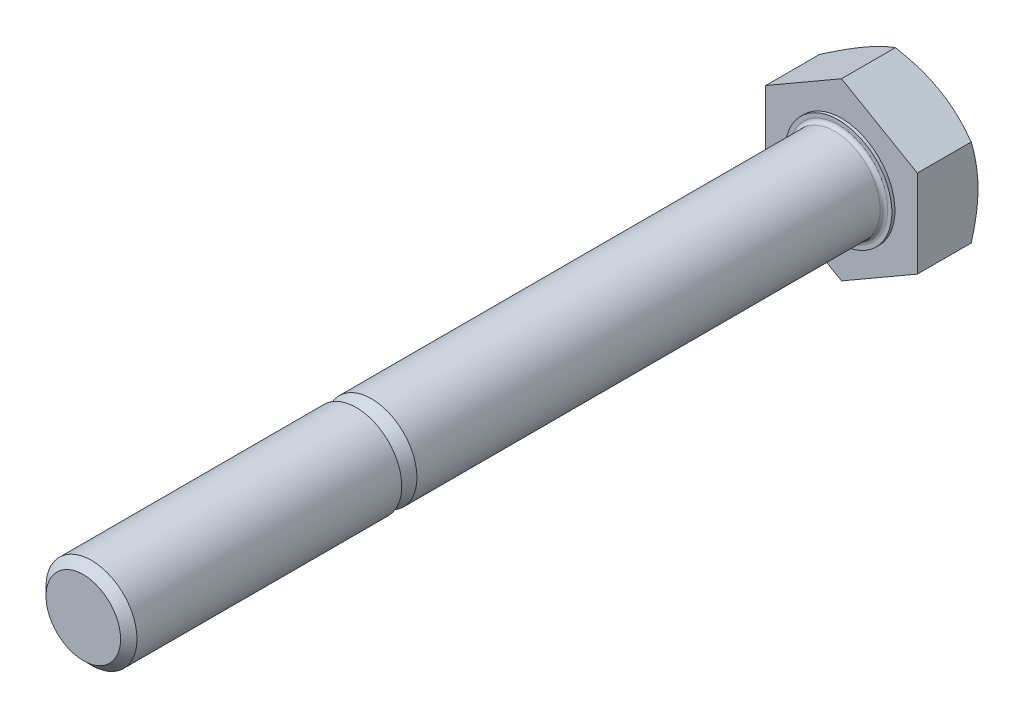
ISO-10303-21;
HEADER;
FILE_DESCRIPTION(('STEP AP214'),'2;1');
FILE_NAME('part.step','',(''),(''),'','','');
FILE_SCHEMA(('AUTOMOTIVE_DESIGN { 1 0 10303 214 1 1 1 1 }'));
ENDSEC;
DATA;
#1=APPLICATION_CONTEXT('core data for automotive mechanical design processes');
#2=APPLICATION_PROTOCOL_DEFINITION('international standard','automotive_design',2000,#1);
#3=PRODUCT_CONTEXT('',#1,'mechanical');
#4=PRODUCT('Part','Part','',(#3));
#5=PRODUCT_RELATED_PRODUCT_CATEGORY('part','',(#4));
#6=PRODUCT_DEFINITION_FORMATION('','',#4);
#7=PRODUCT_DEFINITION_CONTEXT('part definition',#1,'design');
#8=PRODUCT_DEFINITION('design','',#6,#7);
#9=PRODUCT_DEFINITION_SHAPE('','',#8);
#10=(LENGTH_UNIT() NAMED_UNIT(*) SI_UNIT(.MILLI.,.METRE.));
#11=(NAMED_UNIT(*) PLANE_ANGLE_UNIT() SI_UNIT($,.RADIAN.));
#12=(NAMED_UNIT(*) SI_UNIT($,.STERADIAN.) SOLID_ANGLE_UNIT());
#13=UNCERTAINTY_MEASURE_WITH_UNIT(LENGTH_MEASURE(1.E-05),#10,'distance_accuracy_value','');
#14=(GEOMETRIC_REPRESENTATION_CONTEXT(3) GLOBAL_UNCERTAINTY_ASSIGNED_CONTEXT((#13)) GLOBAL_UNIT_ASSIGNED_CONTEXT((#10,
#11,#12)) REPRESENTATION_CONTEXT('',''));
#15=CARTESIAN_POINT('',(0.,0.,0.));
#16=DIRECTION('',(0.,0.,1.));
#17=DIRECTION('',(1.,0.,0.));
#18=AXIS2_PLACEMENT_3D('',#15,#16,#17);
#19=CARTESIAN_POINT('',(5.,-2.88675134594812,-5.));
#20=DIRECTION('',(-0.5,0.866025403784439,0.));
#21=DIRECTION('',(0.866025403784439,0.5,0.));
#22=AXIS2_PLACEMENT_3D('',#19,#20,#21);
#23=PLANE('',#22);
#24=CARTESIAN_POINT('',(5.000002,-2.88675019124759,-3.55341734594793));
#25=CARTESIAN_POINT('',(4.78027074694607,-3.01361208934764,-3.62667401283849));
#26=CARTESIAN_POINT('',(4.5586601198803,-3.14155904453935,-3.69330350087609));
#27=CARTESIAN_POINT('',(4.11160176522467,-3.39966830594325,-3.80960388176341));
#28=CARTESIAN_POINT('',(3.88614609670003,-3.52983519685628,-3.859233638035));
#29=CARTESIAN_POINT('',(3.43799439633442,-3.78857570170015,-3.93647343389728));
#30=CARTESIAN_POINT('',(3.21536814331772,-3.91710902880802,-3.96459799992946));
#31=CARTESIAN_POINT('',(2.8806459561398,-4.11036097367893,-3.98981464288414));
#32=CARTESIAN_POINT('',(2.76899557601673,-4.17482235069811,-3.99539321968897));
#33=CARTESIAN_POINT('',(2.54559174139457,-4.30380461475521,-4.00079886451652));
#34=CARTESIAN_POINT('',(2.43383829018766,-4.36832549989239,-4.00062611028573));
#35=CARTESIAN_POINT('',(2.12769088590962,-4.54507978616402,-3.99223835401767));
#36=CARTESIAN_POINT('',(1.93339845483021,-4.65725457354923,-3.97816111429647));
#37=CARTESIAN_POINT('',(1.54610304420474,-4.88085968312974,-3.93352860367383));
#38=CARTESIAN_POINT('',(1.35310142524446,-4.9922892197905,-3.90295808665975));
#39=CARTESIAN_POINT('',(0.965026180739004,-5.21634456667155,-3.826542206783));
#40=CARTESIAN_POINT('',(0.770001514907567,-5.32894210998795,-3.78037315312653));
#41=CARTESIAN_POINT('',(0.382860131316657,-5.55245829201861,-3.67558875648398));
#42=CARTESIAN_POINT('',(0.190738457644298,-5.66337979203051,-3.61699801824105));
#43=CARTESIAN_POINT('',(-1.9999999993508E-06,-5.7735038465968,-3.55341734594793));
#44=B_SPLINE_CURVE_WITH_KNOTS('',3,(#24,#25,#26,#27,#28,#29,#30,#31,#32,#33,#34,#35,#36,#37,#38,
#39,#40,#41,#42,#43),.UNSPECIFIED.,.F.,.F.,(4,2,2,2,2,2,2,2,2,4),(0.,0.792540187012439,
1.58698486313849,2.36176947896395,2.74878786986339,3.13579429986343,3.80946255620209,
4.48375460996337,5.17299926182492,5.86089121185928),.UNSPECIFIED.);
#45=CARTESIAN_POINT('',(5.,-2.88675134594812,-3.5534180126148));
#46=VERTEX_POINT('',#45);
#47=CARTESIAN_POINT('',(2.5,-4.33012701892219,-4.));
#48=VERTEX_POINT('',#47);
#49=EDGE_CURVE('E136',#46,#48,#44,.T.);
#50=ORIENTED_EDGE('',*,*,#49,.F.);
#51=DIRECTION('',(0.,0.,-1.));
#52=VECTOR('',#51,1.);
#53=CARTESIAN_POINT('',(5.,-2.88675134594812,-2.61479466551195E-09));
#54=LINE('',#53,#52);
#55=CARTESIAN_POINT('',(5.,-2.88675134594812,-2.61479466551195E-09));
#56=VERTEX_POINT('',#55);
#57=EDGE_CURVE('E121',#56,#46,#54,.T.);
#58=ORIENTED_EDGE('',*,*,#57,.F.);
#59=DIRECTION('',(0.866025403784438,0.500000000000001,0.));
#60=VECTOR('',#59,1.);
#61=CARTESIAN_POINT('',(5.,-2.88675134594812,-2.61479466551195E-09));
#62=LINE('',#61,#60);
#63=CARTESIAN_POINT('',(0.,-5.77350269189626,-2.61479466551195E-09));
#64=VERTEX_POINT('',#63);
#65=EDGE_CURVE('E127',#64,#56,#62,.T.);
#66=ORIENTED_EDGE('',*,*,#65,.F.);
#67=DIRECTION('',(0.,0.,-1.));
#68=VECTOR('',#67,1.);
#69=CARTESIAN_POINT('',(0.,-5.77350269189626,-2.61479466551195E-09));
#70=LINE('',#69,#68);
#71=CARTESIAN_POINT('',(0.,-5.77350269189626,-3.55341801261479));
#72=VERTEX_POINT('',#71);
#73=EDGE_CURVE('E244',#64,#72,#70,.T.);
#74=ORIENTED_EDGE('',*,*,#73,.T.);
#75=EDGE_CURVE('E59',#48,#72,#44,.T.);
#76=ORIENTED_EDGE('',*,*,#75,.F.);
#77=EDGE_LOOP('',(#50,#58,#66,#74,#76));
#78=FACE_BOUND('',#77,.T.);
#79=ADVANCED_FACE('F44',(#78),#23,.F.);
#80=CARTESIAN_POINT('',(0.,-5.77350269189626,-5.));
#81=DIRECTION('',(0.5,0.866025403784439,0.));
#82=DIRECTION('',(0.866025403784439,-0.5,0.));
#83=AXIS2_PLACEMENT_3D('',#80,#81,#82);
#84=PLANE('',#83);
#85=CARTESIAN_POINT('',(2.00000000064743E-06,-5.7735038465968,-3.55341734594793));
#86=CARTESIAN_POINT('',(-0.219729253053924,-5.64664194849674,-3.62667401283849));
#87=CARTESIAN_POINT('',(-0.441339880119702,-5.51869499330503,-3.69330350087609));
#88=CARTESIAN_POINT('',(-0.888398234775334,-5.26058573190113,-3.80960388176341));
#89=CARTESIAN_POINT('',(-1.11385390329997,-5.13041884098811,-3.85923363803499));
#90=CARTESIAN_POINT('',(-1.56200560366558,-4.87167833614423,-3.93647343389728));
#91=CARTESIAN_POINT('',(-1.78463185668228,-4.74314500903636,-3.96459799992946));
#92=CARTESIAN_POINT('',(-2.1193540438602,-4.54989306416545,-3.98981464288413));
#93=CARTESIAN_POINT('',(-2.23100442398327,-4.48543168714627,-3.99539321968897));
#94=CARTESIAN_POINT('',(-2.45440825860543,-4.35644942308917,-4.00079886451652));
#95=CARTESIAN_POINT('',(-2.56616170981234,-4.291928537952,-4.00062611028572));
#96=CARTESIAN_POINT('',(-2.87230911409038,-4.11517425168036,-3.99223835401768));
#97=CARTESIAN_POINT('',(-3.06660154516979,-4.00299946429516,-3.97816111429647));
#98=CARTESIAN_POINT('',(-3.45389695579525,-3.77939435471464,-3.93352860367382));
#99=CARTESIAN_POINT('',(-3.64689857475554,-3.66796481805389,-3.90295808665975));
#100=CARTESIAN_POINT('',(-4.03497381926099,-3.44390947117283,-3.826542206783));
#101=CARTESIAN_POINT('',(-4.22999848509243,-3.33131192785644,-3.78037315312652));
#102=CARTESIAN_POINT('',(-4.61713986868334,-3.10779574582578,-3.67558875648398));
#103=CARTESIAN_POINT('',(-4.8092615423557,-2.99687424581388,-3.61699801824105));
#104=CARTESIAN_POINT('',(-5.000002,-2.88675019124759,-3.55341734594793));
#105=B_SPLINE_CURVE_WITH_KNOTS('',3,(#85,#86,#87,#88,#89,#90,#91,#92,#93,#94,#95,#96,#97,#98,
#99,#100,#101,#102,#103,#104),.UNSPECIFIED.,.F.,.F.,(4,2,2,2,2,2,2,2,2,4),(0.,0.792540187012439,
1.58698486313849,2.36176947896395,2.74878786986339,3.13579429986343,3.80946255620209,
4.48375460996337,5.17299926182492,5.86089121185927),.UNSPECIFIED.);
#106=CARTESIAN_POINT('',(-2.5,-4.3301270189222,-4.));
#107=VERTEX_POINT('',#106);
#108=EDGE_CURVE('E186',#72,#107,#105,.T.);
#109=ORIENTED_EDGE('',*,*,#108,.F.);
#110=ORIENTED_EDGE('',*,*,#73,.F.);
#111=DIRECTION('',(0.866025403784439,-0.5,0.));
#112=VECTOR('',#111,1.);
#113=CARTESIAN_POINT('',(0.,-5.77350269189626,-2.61479466551195E-09));
#114=LINE('',#113,#112);
#115=CARTESIAN_POINT('',(-5.,-2.88675134594813,-2.61479466551195E-09));
#116=VERTEX_POINT('',#115);
#117=EDGE_CURVE('E132',#116,#64,#114,.T.);
#118=ORIENTED_EDGE('',*,*,#117,.F.);
#119=DIRECTION('',(0.,0.,-1.));
#120=VECTOR('',#119,1.);
#121=CARTESIAN_POINT('',(-5.,-2.88675134594813,-2.61479466551195E-09));
#122=LINE('',#121,#120);
#123=CARTESIAN_POINT('',(-5.,-2.88675134594813,-3.55341801261479));
#124=VERTEX_POINT('',#123);
#125=EDGE_CURVE('E249',#116,#124,#122,.T.);
#126=ORIENTED_EDGE('',*,*,#125,.T.);
#127=EDGE_CURVE('E67',#107,#124,#105,.T.);
#128=ORIENTED_EDGE('',*,*,#127,.F.);
#129=EDGE_LOOP('',(#109,#110,#118,#126,#128));
#130=FACE_BOUND('',#129,.T.);
#131=ADVANCED_FACE('F236',(#130),#84,.F.);
#132=CARTESIAN_POINT('',(-5.,-2.88675134594813,-5.));
#133=DIRECTION('',(1.,0.,0.));
#134=DIRECTION('',(0.,-1.,0.));
#135=AXIS2_PLACEMENT_3D('',#132,#133,#134);
#136=PLANE('',#135);
#137=CARTESIAN_POINT('',(-5.,7.65620989160719,-1.60730851220314));
#138=CARTESIAN_POINT('',(-5.,7.43668068445187,-1.71339764971142));
#139=CARTESIAN_POINT('',(-5.00000000000001,7.2166324498112,-1.81843220971194));
#140=CARTESIAN_POINT('',(-5.00000000000001,6.775217292149,-2.02578955660455));
#141=CARTESIAN_POINT('',(-5.,6.55385014884432,-2.12811187401153));
#142=CARTESIAN_POINT('',(-5.,6.10832079221154,-2.32998113103873));
#143=CARTESIAN_POINT('',(-5.,5.88414983325619,-2.42950883856025));
#144=CARTESIAN_POINT('',(-5.,5.43396545890422,-2.62428946678928));
#145=CARTESIAN_POINT('',(-5.,5.20795214026934,-2.71954261031161));
#146=CARTESIAN_POINT('',(-5.,4.75091730358843,-2.90576853562678));
#147=CARTESIAN_POINT('',(-5.,4.51986836696229,-2.99667439468201));
#148=CARTESIAN_POINT('',(-5.,4.05504511794165,-3.17136663535019));
#149=CARTESIAN_POINT('',(-5.,3.82127050561654,-3.25515222488515));
#150=CARTESIAN_POINT('',(-5.,3.3511049214154,-3.41335295122633));
#151=CARTESIAN_POINT('',(-5.,3.1147207202618,-3.48778800852407));
#152=CARTESIAN_POINT('',(-5.,2.63858935414024,-3.62486947210752));
#153=CARTESIAN_POINT('',(-5.,2.39884327849118,-3.6875196062624));
#154=CARTESIAN_POINT('',(-5.,1.91583600979795,-3.79799301517174));
#155=CARTESIAN_POINT('',(-5.,1.67257390027251,-3.845812348464));
#156=CARTESIAN_POINT('',(-5.,1.18308256945893,-3.92339260894802));
#157=CARTESIAN_POINT('',(-5.,0.936853345569401,-3.95315352030607));
#158=CARTESIAN_POINT('',(-5.,0.567117593289451,-3.98234325133118));
#159=CARTESIAN_POINT('',(-5.,0.444189898759255,-3.98949936634909));
#160=CARTESIAN_POINT('',(-5.,0.198136128994921,-3.99860265589306));
#161=CARTESIAN_POINT('',(-5.,0.0750100563582885,-4.00054989807679));
#162=CARTESIAN_POINT('',(-5.,-0.171177216207566,-3.99918313774808));
#163=CARTESIAN_POINT('',(-5.,-0.29423842464402,-3.99587061329656));
#164=CARTESIAN_POINT('',(-5.,-0.540114422491311,-3.98406827403109));
#165=CARTESIAN_POINT('',(-5.,-0.662929199152969,-3.97557819794883));
#166=CARTESIAN_POINT('',(-5.,-0.960602635172517,-3.94890221291608));
#167=CARTESIAN_POINT('',(-5.,-1.13523252606317,-3.92812146624754));
#168=CARTESIAN_POINT('',(-5.,-1.48312982453558,-3.87724859224778));
#169=CARTESIAN_POINT('',(-5.,-1.65639704728773,-3.84715522336811));
#170=CARTESIAN_POINT('',(-5.,-2.0014599099285,-3.77872143768563));
#171=CARTESIAN_POINT('',(-5.,-2.17325390132186,-3.74037278751756));
#172=CARTESIAN_POINT('',(-5.,-2.51508012917844,-3.65659803659306));
#173=CARTESIAN_POINT('',(-5.,-2.68511247222647,-3.61117236671524));
#174=CARTESIAN_POINT('',(-5.,-3.02759472997325,-3.51314465542335));
#175=CARTESIAN_POINT('',(-5.,-3.20000183568428,-3.46039407843568));
#176=CARTESIAN_POINT('',(-5.,-3.54299370259063,-3.34968060702553));
#177=CARTESIAN_POINT('',(-5.,-3.71357963115188,-3.29172130765132));
#178=CARTESIAN_POINT('',(-5.,-4.0522446464634,-3.17178761900049));
#179=CARTESIAN_POINT('',(-5.,-4.22033243885282,-3.10983766516145));
#180=CARTESIAN_POINT('',(-5.,-4.55520387372808,-2.98230148307792));
#181=CARTESIAN_POINT('',(-5.,-4.72198695763952,-2.91671378527652));
#182=CARTESIAN_POINT('',(-5.,-4.88816412582649,-2.84966706307693));
#183=B_SPLINE_CURVE_WITH_KNOTS('',3,(#137,#138,#139,#140,#141,#142,#143,#144,#145,#146,#147,
#148,#149,#150,#151,#152,#153,#154,#155,#156,#157,#158,#159,#160,#161,#162,#163,#164,#165,#166,
#167,#168,#169,#170,#171,#172,#173,#174,#175,#176,#177,#178,#179,#180,#181,#182),.UNSPECIFIED.,
.F.,.F.,(4,2,2,2,2,2,2,2,2,2,2,2,2,2,2,2,2,2,2,2,2,2,4),(0.,0.731468501053905,1.46306280212576,
2.19884351250473,2.93458582511369,3.67936259473395,4.42422210717281,5.16746683356835,
5.91047605604178,6.65368257320433,7.39688974201328,7.7662034178799,8.1355122967349,
8.50471741349089,8.87394116252394,9.40123334160666,9.92859584900567,10.456486776027,
10.9843455753877,11.5251349139371,12.0655538262241,12.6029309498223,13.1405267642076),.UNSPECIFIED.);
#184=CARTESIAN_POINT('',(-5.,0.,-4.));
#185=VERTEX_POINT('',#184);
#186=EDGE_CURVE('E230',#124,#185,#183,.F.);
#187=ORIENTED_EDGE('',*,*,#186,.F.);
#188=ORIENTED_EDGE('',*,*,#125,.F.);
#189=DIRECTION('',(0.,-1.,0.));
#190=VECTOR('',#189,1.);
#191=CARTESIAN_POINT('',(-5.,-2.88675134594813,-2.61479466551195E-09));
#192=LINE('',#191,#190);
#193=CARTESIAN_POINT('',(-5.,2.88675134594813,-2.61479466551195E-09));
#194=VERTEX_POINT('',#193);
#195=EDGE_CURVE('E253',#194,#116,#192,.T.);
#196=ORIENTED_EDGE('',*,*,#195,.F.);
#197=DIRECTION('',(0.,0.,-1.));
#198=VECTOR('',#197,1.);
#199=CARTESIAN_POINT('',(-5.,2.88675134594813,-2.61479466551195E-09));
#200=LINE('',#199,#198);
#201=CARTESIAN_POINT('',(-5.,2.88675134594813,-3.55341801261479));
#202=VERTEX_POINT('',#201);
#203=EDGE_CURVE('E251',#194,#202,#200,.T.);
#204=ORIENTED_EDGE('',*,*,#203,.T.);
#205=EDGE_CURVE('E223',#185,#202,#183,.F.);
#206=ORIENTED_EDGE('',*,*,#205,.F.);
#207=EDGE_LOOP('',(#187,#188,#196,#204,#206));
#208=FACE_BOUND('',#207,.T.);
#209=ADVANCED_FACE('F232',(#208),#136,.F.);
#210=CARTESIAN_POINT('',(-5.,2.88675134594813,-5.));
#211=DIRECTION('',(0.5,-0.866025403784439,0.));
#212=DIRECTION('',(-0.866025403784439,-0.5,0.));
#213=AXIS2_PLACEMENT_3D('',#210,#211,#212);
#214=PLANE('',#213);
#215=CARTESIAN_POINT('',(-5.000002,2.88675019124759,-3.55341734594793));
#216=CARTESIAN_POINT('',(-4.78027074694607,3.01361208934765,-3.62667401283849));
#217=CARTESIAN_POINT('',(-4.5586601198803,3.14155904453936,-3.69330350087609));
#218=CARTESIAN_POINT('',(-4.11160176522467,3.39966830594326,-3.80960388176341));
#219=CARTESIAN_POINT('',(-3.88614609670003,3.52983519685628,-3.859233638035));
#220=CARTESIAN_POINT('',(-3.43799439633442,3.78857570170016,-3.93647343389728));
#221=CARTESIAN_POINT('',(-3.21536814331772,3.91710902880803,-3.96459799992946));
#222=CARTESIAN_POINT('',(-2.8806459561398,4.11036097367894,-3.98981464288413));
#223=CARTESIAN_POINT('',(-2.76899557601673,4.17482235069812,-3.99539321968897));
#224=CARTESIAN_POINT('',(-2.54559174139457,4.30380461475522,-4.00079886451652));
#225=CARTESIAN_POINT('',(-2.43383829018766,4.36832549989239,-4.00062611028572));
#226=CARTESIAN_POINT('',(-2.12769088590962,4.54507978616403,-3.99223835401768));
#227=CARTESIAN_POINT('',(-1.93339845483021,4.65725457354923,-3.97816111429647));
#228=CARTESIAN_POINT('',(-1.54610304420475,4.88085968312975,-3.93352860367382));
#229=CARTESIAN_POINT('',(-1.35310142524446,4.9922892197905,-3.90295808665975));
#230=CARTESIAN_POINT('',(-0.965026180739006,5.21634456667156,-3.826542206783));
#231=CARTESIAN_POINT('',(-0.77000151490757,5.32894210998795,-3.78037315312652));
#232=CARTESIAN_POINT('',(-0.38286013131666,5.55245829201861,-3.67558875648398));
#233=CARTESIAN_POINT('',(-0.190738457644301,5.66337979203051,-3.61699801824105));
#234=CARTESIAN_POINT('',(1.99999999749083E-06,5.7735038465968,-3.55341734594793));
#235=B_SPLINE_CURVE_WITH_KNOTS('',3,(#215,#216,#217,#218,#219,#220,#221,#222,#223,#224,#225,
#226,#227,#228,#229,#230,#231,#232,#233,#234),.UNSPECIFIED.,.F.,.F.,(4,2,2,2,2,2,2,2,2,4),(0.,
0.792540187012439,1.58698486313849,2.36176947896395,2.74878786986339,3.13579429986343,
3.80946255620209,4.48375460996337,5.17299926182492,5.86089121185927),.UNSPECIFIED.);
#236=CARTESIAN_POINT('',(-2.5,4.3301270189222,-4.));
#237=VERTEX_POINT('',#236);
#238=EDGE_CURVE('E231',#202,#237,#235,.T.);
#239=ORIENTED_EDGE('',*,*,#238,.F.);
#240=ORIENTED_EDGE('',*,*,#203,.F.);
#241=DIRECTION('',(-0.866025403784439,-0.5,0.));
#242=VECTOR('',#241,1.);
#243=CARTESIAN_POINT('',(-5.,2.88675134594813,-2.61479466551195E-09));
#244=LINE('',#243,#242);
#245=CARTESIAN_POINT('',(0.,5.77350269189626,-2.61479466551195E-09));
#246=VERTEX_POINT('',#245);
#247=EDGE_CURVE('E265',#246,#194,#244,.T.);
#248=ORIENTED_EDGE('',*,*,#247,.F.);
#249=DIRECTION('',(0.,0.,-1.));
#250=VECTOR('',#249,1.);
#251=CARTESIAN_POINT('',(0.,5.77350269189626,-2.61479466551195E-09));
#252=LINE('',#251,#250);
#253=CARTESIAN_POINT('',(0.,5.77350269189626,-3.55341801261479));
#254=VERTEX_POINT('',#253);
#255=EDGE_CURVE('E145',#246,#254,#252,.T.);
#256=ORIENTED_EDGE('',*,*,#255,.T.);
#257=EDGE_CURVE('E217',#237,#254,#235,.T.);
#258=ORIENTED_EDGE('',*,*,#257,.F.);
#259=EDGE_LOOP('',(#239,#240,#248,#256,#258));
#260=FACE_BOUND('',#259,.T.);
#261=ADVANCED_FACE('F235',(#260),#214,.F.);
#262=CARTESIAN_POINT('',(0.,5.77350269189626,-5.));
#263=DIRECTION('',(-0.5,-0.866025403784439,0.));
#264=DIRECTION('',(-0.866025403784439,0.5,0.));
#265=AXIS2_PLACEMENT_3D('',#262,#263,#264);
#266=PLANE('',#265);
#267=CARTESIAN_POINT('',(-2.00000000176389E-06,5.7735038465968,-3.55341734594793));
#268=CARTESIAN_POINT('',(0.219729253053923,5.64664194849674,-3.62667401283849));
#269=CARTESIAN_POINT('',(0.441339880119701,5.51869499330503,-3.69330350087608));
#270=CARTESIAN_POINT('',(0.888398234775333,5.26058573190113,-3.80960388176341));
#271=CARTESIAN_POINT('',(1.11385390329997,5.13041884098811,-3.85923363803499));
#272=CARTESIAN_POINT('',(1.56200560366558,4.87167833614423,-3.93647343389727));
#273=CARTESIAN_POINT('',(1.78463185668228,4.74314500903636,-3.96459799992946));
#274=CARTESIAN_POINT('',(2.1193540438602,4.54989306416545,-3.98981464288413));
#275=CARTESIAN_POINT('',(2.23100442398327,4.48543168714627,-3.99539321968896));
#276=CARTESIAN_POINT('',(2.45440825860543,4.35644942308917,-4.00079886451652));
#277=CARTESIAN_POINT('',(2.56616170981234,4.291928537952,-4.00062611028572));
#278=CARTESIAN_POINT('',(2.87230911409038,4.11517425168036,-3.99223835401768));
#279=CARTESIAN_POINT('',(3.06660154516979,4.00299946429516,-3.97816111429647));
#280=CARTESIAN_POINT('',(3.45389695579525,3.77939435471464,-3.93352860367382));
#281=CARTESIAN_POINT('',(3.64689857475554,3.66796481805389,-3.90295808665975));
#282=CARTESIAN_POINT('',(4.03497381926099,3.44390947117283,-3.826542206783));
#283=CARTESIAN_POINT('',(4.22999848509243,3.33131192785644,-3.78037315312652));
#284=CARTESIAN_POINT('',(4.61713986868334,3.10779574582578,-3.67558875648398));
#285=CARTESIAN_POINT('',(4.8092615423557,2.99687424581388,-3.61699801824105));
#286=CARTESIAN_POINT('',(5.000002,2.88675019124759,-3.55341734594793));
#287=B_SPLINE_CURVE_WITH_KNOTS('',3,(#267,#268,#269,#270,#271,#272,#273,#274,#275,#276,#277,
#278,#279,#280,#281,#282,#283,#284,#285,#286),.UNSPECIFIED.,.F.,.F.,(4,2,2,2,2,2,2,2,2,4),(0.,
0.792540187012439,1.58698486313849,2.36176947896395,2.74878786986339,3.13579429986343,
3.80946255620209,4.48375460996337,5.17299926182492,5.86089121185927),.UNSPECIFIED.);
#288=CARTESIAN_POINT('',(2.5,4.3301270189222,-4.));
#289=VERTEX_POINT('',#288);
#290=EDGE_CURVE('E269',#254,#289,#287,.T.);
#291=ORIENTED_EDGE('',*,*,#290,.F.);
#292=ORIENTED_EDGE('',*,*,#255,.F.);
#293=DIRECTION('',(-0.866025403784439,0.5,0.));
#294=VECTOR('',#293,1.);
#295=CARTESIAN_POINT('',(0.,5.77350269189626,-2.61479466551195E-09));
#296=LINE('',#295,#294);
#297=CARTESIAN_POINT('',(5.,2.88675134594813,-2.61479466551195E-09));
#298=VERTEX_POINT('',#297);
#299=EDGE_CURVE('E126',#298,#246,#296,.T.);
#300=ORIENTED_EDGE('',*,*,#299,.F.);
#301=DIRECTION('',(0.,0.,-1.));
#302=VECTOR('',#301,1.);
#303=CARTESIAN_POINT('',(5.,2.88675134594813,-2.61479466551195E-09));
#304=LINE('',#303,#302);
#305=CARTESIAN_POINT('',(5.,2.88675134594813,-3.55341801261479));
#306=VERTEX_POINT('',#305);
#307=EDGE_CURVE('E123',#298,#306,#304,.T.);
#308=ORIENTED_EDGE('',*,*,#307,.T.);
#309=EDGE_CURVE('E152',#289,#306,#287,.T.);
#310=ORIENTED_EDGE('',*,*,#309,.F.);
#311=EDGE_LOOP('',(#291,#292,#300,#308,#310));
#312=FACE_BOUND('',#311,.T.);
#313=ADVANCED_FACE('F267',(#312),#266,.F.);
#314=CARTESIAN_POINT('',(5.,2.88675134594813,-5.));
#315=DIRECTION('',(-1.,0.,0.));
#316=DIRECTION('',(0.,1.,0.));
#317=AXIS2_PLACEMENT_3D('',#314,#315,#316);
#318=PLANE('',#317);
#319=CARTESIAN_POINT('',(5.,7.6562098916072,-1.60730851220314));
#320=CARTESIAN_POINT('',(5.,7.43668068445188,-1.71339764971142));
#321=CARTESIAN_POINT('',(5.,7.21663244981121,-1.81843220971194));
#322=CARTESIAN_POINT('',(5.,6.77521729214901,-2.02578955660455));
#323=CARTESIAN_POINT('',(5.,6.55385014884433,-2.12811187401152));
#324=CARTESIAN_POINT('',(5.,6.10832079221155,-2.32998113103873));
#325=CARTESIAN_POINT('',(5.,5.8841498332562,-2.42950883856025));
#326=CARTESIAN_POINT('',(5.,5.43396545890423,-2.62428946678928));
#327=CARTESIAN_POINT('',(5.,5.20795214026935,-2.71954261031161));
#328=CARTESIAN_POINT('',(5.,4.75091730358844,-2.90576853562678));
#329=CARTESIAN_POINT('',(5.,4.51986836696229,-2.99667439468201));
#330=CARTESIAN_POINT('',(5.,4.05504511794166,-3.17136663535019));
#331=CARTESIAN_POINT('',(5.,3.82127050561655,-3.25515222488515));
#332=CARTESIAN_POINT('',(5.,3.3511049214154,-3.41335295122633));
#333=CARTESIAN_POINT('',(5.,3.1147207202618,-3.48778800852407));
#334=CARTESIAN_POINT('',(5.,2.63858935414024,-3.62486947210752));
#335=CARTESIAN_POINT('',(5.,2.39884327849118,-3.6875196062624));
#336=CARTESIAN_POINT('',(5.,1.91583600979795,-3.79799301517174));
#337=CARTESIAN_POINT('',(5.,1.67257390027251,-3.845812348464));
#338=CARTESIAN_POINT('',(5.,1.18308256945893,-3.92339260894802));
#339=CARTESIAN_POINT('',(5.,0.936853345569402,-3.95315352030607));
#340=CARTESIAN_POINT('',(5.,0.567117593289452,-3.98234325133118));
#341=CARTESIAN_POINT('',(5.,0.444189898759256,-3.98949936634909));
#342=CARTESIAN_POINT('',(5.,0.198136128994923,-3.99860265589306));
#343=CARTESIAN_POINT('',(5.,0.0750100563582902,-4.00054989807679));
#344=CARTESIAN_POINT('',(5.,-0.171177216207564,-3.99918313774808));
#345=CARTESIAN_POINT('',(5.,-0.294238424644018,-3.99587061329656));
#346=CARTESIAN_POINT('',(5.,-0.540114422491308,-3.98406827403109));
#347=CARTESIAN_POINT('',(5.,-0.662929199152966,-3.97557819794883));
#348=CARTESIAN_POINT('',(5.,-0.960602635172513,-3.94890221291608));
#349=CARTESIAN_POINT('',(5.,-1.13523252606317,-3.92812146624754));
#350=CARTESIAN_POINT('',(5.,-1.48312982453558,-3.87724859224778));
#351=CARTESIAN_POINT('',(5.,-1.65639704728773,-3.84715522336811));
#352=CARTESIAN_POINT('',(5.,-2.0014599099285,-3.77872143768562));
#353=CARTESIAN_POINT('',(5.,-2.17325390132186,-3.74037278751756));
#354=CARTESIAN_POINT('',(5.,-2.51508012917844,-3.65659803659306));
#355=CARTESIAN_POINT('',(5.,-2.68511247222647,-3.61117236671524));
#356=CARTESIAN_POINT('',(5.,-3.02759472997325,-3.51314465542335));
#357=CARTESIAN_POINT('',(5.,-3.20000183568428,-3.46039407843568));
#358=CARTESIAN_POINT('',(5.,-3.54299370259063,-3.34968060702553));
#359=CARTESIAN_POINT('',(5.,-3.71357963115188,-3.29172130765132));
#360=CARTESIAN_POINT('',(5.,-4.0522446464634,-3.17178761900049));
#361=CARTESIAN_POINT('',(5.00000000000001,-4.22033243885282,-3.10983766516145));
#362=CARTESIAN_POINT('',(5.00000000000001,-4.55520387372808,-2.98230148307792));
#363=CARTESIAN_POINT('',(5.,-4.72198695763952,-2.91671378527652));
#364=CARTESIAN_POINT('',(5.,-4.88816412582649,-2.84966706307693));
#365=B_SPLINE_CURVE_WITH_KNOTS('',3,(#319,#320,#321,#322,#323,#324,#325,#326,#327,#328,#329,
#330,#331,#332,#333,#334,#335,#336,#337,#338,#339,#340,#341,#342,#343,#344,#345,#346,#347,#348,
#349,#350,#351,#352,#353,#354,#355,#356,#357,#358,#359,#360,#361,#362,#363,#364),.UNSPECIFIED.,
.F.,.F.,(4,2,2,2,2,2,2,2,2,2,2,2,2,2,2,2,2,2,2,2,2,2,4),(0.,0.731468501053904,1.46306280212576,
2.19884351250473,2.93458582511369,3.67936259473395,4.42422210717282,5.16746683356836,
5.91047605604179,6.65368257320434,7.39688974201329,7.76620341787991,8.13551229673491,
8.5047174134909,8.87394116252395,9.40123334160666,9.92859584900567,10.456486776027,
10.9843455753877,11.5251349139371,12.0655538262241,12.6029309498223,13.1405267642076),.UNSPECIFIED.);
#366=CARTESIAN_POINT('',(5.,0.,-4.));
#367=VERTEX_POINT('',#366);
#368=EDGE_CURVE('E318',#306,#367,#365,.T.);
#369=ORIENTED_EDGE('',*,*,#368,.F.);
#370=ORIENTED_EDGE('',*,*,#307,.F.);
#371=DIRECTION('',(0.,1.,0.));
#372=VECTOR('',#371,1.);
#373=CARTESIAN_POINT('',(5.,2.88675134594813,-2.61479466551195E-09));
#374=LINE('',#373,#372);
#375=EDGE_CURVE('E117',#56,#298,#374,.T.);
#376=ORIENTED_EDGE('',*,*,#375,.F.);
#377=ORIENTED_EDGE('',*,*,#57,.T.);
#378=EDGE_CURVE('E193',#367,#46,#365,.T.);
#379=ORIENTED_EDGE('',*,*,#378,.F.);
#380=EDGE_LOOP('',(#369,#370,#376,#377,#379));
#381=FACE_BOUND('',#380,.T.);
#382=ADVANCED_FACE('F119',(#381),#318,.F.);
#383=CARTESIAN_POINT('',(0.,0.,-3.55255354137804));
#384=DIRECTION('',(0.,0.,1.));
#385=DIRECTION('',(-1.,0.,0.));
#386=AXIS2_PLACEMENT_3D('',#383,#384,#385);
#387=CONICAL_SURFACE('',#386,5.775,1.0471975511966);
#388=CARTESIAN_POINT('',(0.,0.,-4.));
#389=DIRECTION('',(0.,0.,1.));
#390=DIRECTION('',(-1.,0.,0.));
#391=AXIS2_PLACEMENT_3D('',#388,#389,#390);
#392=CIRCLE('',#391,5.);
#393=EDGE_CURVE('E153',#107,#48,#392,.T.);
#394=ORIENTED_EDGE('',*,*,#393,.T.);
#395=ORIENTED_EDGE('',*,*,#75,.T.);
#396=ORIENTED_EDGE('',*,*,#108,.T.);
#397=EDGE_LOOP('',(#394,#395,#396));
#398=FACE_BOUND('',#397,.T.);
#399=ADVANCED_FACE('F208',(#398),#387,.T.);
#400=EDGE_CURVE('E736',#367,#289,#392,.T.);
#401=ORIENTED_EDGE('',*,*,#400,.T.);
#402=ORIENTED_EDGE('',*,*,#309,.T.);
#403=ORIENTED_EDGE('',*,*,#368,.T.);
#404=EDGE_LOOP('',(#401,#402,#403));
#405=FACE_BOUND('',#404,.T.);
#406=ADVANCED_FACE('F209',(#405),#387,.T.);
#407=EDGE_CURVE('E142',#289,#237,#392,.T.);
#408=ORIENTED_EDGE('',*,*,#407,.T.);
#409=ORIENTED_EDGE('',*,*,#257,.T.);
#410=ORIENTED_EDGE('',*,*,#290,.T.);
#411=EDGE_LOOP('',(#408,#409,#410));
#412=FACE_BOUND('',#411,.T.);
#413=ADVANCED_FACE('F275',(#412),#387,.T.);
#414=EDGE_CURVE('E138',#237,#185,#392,.T.);
#415=ORIENTED_EDGE('',*,*,#414,.T.);
#416=ORIENTED_EDGE('',*,*,#205,.T.);
#417=ORIENTED_EDGE('',*,*,#238,.T.);
#418=EDGE_LOOP('',(#415,#416,#417));
#419=FACE_BOUND('',#418,.T.);
#420=ADVANCED_FACE('F284',(#419),#387,.T.);
#421=EDGE_CURVE('E144',#185,#107,#392,.T.);
#422=ORIENTED_EDGE('',*,*,#421,.T.);
#423=ORIENTED_EDGE('',*,*,#127,.T.);
#424=ORIENTED_EDGE('',*,*,#186,.T.);
#425=EDGE_LOOP('',(#422,#423,#424));
#426=FACE_BOUND('',#425,.T.);
#427=ADVANCED_FACE('F292',(#426),#387,.T.);
#428=CARTESIAN_POINT('',(0.,-5.,-4.));
#429=DIRECTION('',(0.,0.,-1.));
#430=DIRECTION('',(1.,0.,0.));
#431=AXIS2_PLACEMENT_3D('',#428,#429,#430);
#432=PLANE('',#431);
#433=ORIENTED_EDGE('',*,*,#421,.F.);
#434=ORIENTED_EDGE('',*,*,#414,.F.);
#435=ORIENTED_EDGE('',*,*,#407,.F.);
#436=ORIENTED_EDGE('',*,*,#400,.F.);
#437=EDGE_CURVE('E740',#48,#367,#392,.T.);
#438=ORIENTED_EDGE('',*,*,#437,.F.);
#439=ORIENTED_EDGE('',*,*,#393,.F.);
#440=EDGE_LOOP('',(#433,#434,#435,#436,#438,#439));
#441=FACE_BOUND('',#440,.T.);
#442=ADVANCED_FACE('F206',(#441),#432,.T.);
#443=ORIENTED_EDGE('',*,*,#378,.T.);
#444=ORIENTED_EDGE('',*,*,#49,.T.);
#445=ORIENTED_EDGE('',*,*,#437,.T.);
#446=EDGE_LOOP('',(#443,#444,#445));
#447=FACE_BOUND('',#446,.T.);
#448=ADVANCED_FACE('F202',(#447),#387,.T.);
#449=CARTESIAN_POINT('',(0.,-5.77350269189626,-2.61479466551195E-09));
#450=DIRECTION('',(0.,0.,-1.));
#451=DIRECTION('',(-1.,0.,0.));
#452=AXIS2_PLACEMENT_3D('',#449,#450,#451);
#453=PLANE('',#452);
#454=CARTESIAN_POINT('',(0.,0.,0.));
#455=DIRECTION('',(0.,0.,-1.));
#456=DIRECTION('',(-1.,0.,0.));
#457=AXIS2_PLACEMENT_3D('',#454,#455,#456);
#458=CIRCLE('',#457,3.5203013293146);
#459=CARTESIAN_POINT('',(-3.5203013293146,0.,0.));
#460=VERTEX_POINT('',#459);
#461=EDGE_CURVE('E134',#460,#460,#458,.T.);
#462=ORIENTED_EDGE('',*,*,#461,.T.);
#463=EDGE_LOOP('',(#462));
#464=FACE_BOUND('',#463,.T.);
#465=ORIENTED_EDGE('',*,*,#65,.T.);
#466=ORIENTED_EDGE('',*,*,#375,.T.);
#467=ORIENTED_EDGE('',*,*,#299,.T.);
#468=ORIENTED_EDGE('',*,*,#247,.T.);
#469=ORIENTED_EDGE('',*,*,#195,.T.);
#470=ORIENTED_EDGE('',*,*,#117,.T.);
#471=EDGE_LOOP('',(#465,#466,#467,#468,#469,#470));
#472=FACE_BOUND('',#471,.T.);
#473=ADVANCED_FACE('F130',(#464,#472),#453,.F.);
#474=CARTESIAN_POINT('',(0.,0.,50.));
#475=DIRECTION('',(0.,0.,-1.));
#476=DIRECTION('',(-1.,0.,0.));
#477=AXIS2_PLACEMENT_3D('',#474,#475,#476);
#478=CYLINDRICAL_SURFACE('',#477,3.00000000000001);
#479=CARTESIAN_POINT('',(0.,0.,49.45875));
#480=DIRECTION('',(0.,0.,1.));
#481=DIRECTION('',(1.,0.,0.));
#482=AXIS2_PLACEMENT_3D('',#479,#480,#481);
#483=CIRCLE('',#482,3.00000000000001);
#484=CARTESIAN_POINT('',(3.00000000000001,0.,49.45875));
#485=VERTEX_POINT('',#484);
#486=EDGE_CURVE('E325',#485,#485,#483,.F.);
#487=ORIENTED_EDGE('',*,*,#486,.T.);
#488=EDGE_LOOP('',(#487));
#489=FACE_BOUND('',#488,.T.);
#490=CARTESIAN_POINT('',(0.,0.,32.));
#491=DIRECTION('',(0.,0.,-1.));
#492=DIRECTION('',(-1.,0.,0.));
#493=AXIS2_PLACEMENT_3D('',#490,#491,#492);
#494=CIRCLE('',#493,3.00000000000001);
#495=CARTESIAN_POINT('',(-3.00000000000001,0.,32.));
#496=VERTEX_POINT('',#495);
#497=EDGE_CURVE('E550',#496,#496,#494,.T.);
#498=ORIENTED_EDGE('',*,*,#497,.F.);
#499=EDGE_LOOP('',(#498));
#500=FACE_BOUND('',#499,.T.);
#501=ADVANCED_FACE('F447',(#489,#500),#478,.T.);
#502=CARTESIAN_POINT('',(3.00000000000001,0.,50.));
#503=DIRECTION('',(0.,0.,1.));
#504=DIRECTION('',(1.,0.,0.));
#505=AXIS2_PLACEMENT_3D('',#502,#503,#504);
#506=PLANE('',#505);
#507=CARTESIAN_POINT('',(0.,0.,50.));
#508=DIRECTION('',(0.,0.,1.));
#509=DIRECTION('',(1.,0.,0.));
#510=AXIS2_PLACEMENT_3D('',#507,#508,#509);
#511=CIRCLE('',#510,2.45875);
#512=CARTESIAN_POINT('',(2.45875000000001,0.,50.));
#513=VERTEX_POINT('',#512);
#514=EDGE_CURVE('E541',#513,#513,#511,.T.);
#515=ORIENTED_EDGE('',*,*,#514,.T.);
#516=EDGE_LOOP('',(#515));
#517=FACE_BOUND('',#516,.T.);
#518=ADVANCED_FACE('F460',(#517),#506,.T.);
#519=CARTESIAN_POINT('',(0.,0.,50.));
#520=DIRECTION('',(0.,0.,-1.));
#521=DIRECTION('',(-1.,0.,0.));
#522=AXIS2_PLACEMENT_3D('',#519,#520,#521);
#523=CYLINDRICAL_SURFACE('',#522,3.5203013293146);
#524=CARTESIAN_POINT('',(0.,0.,0.199999999999999));
#525=DIRECTION('',(0.,0.,-1.));
#526=DIRECTION('',(-1.,0.,0.));
#527=AXIS2_PLACEMENT_3D('',#524,#525,#526);
#528=CIRCLE('',#527,3.5203013293146);
#529=CARTESIAN_POINT('',(-3.5203013293146,0.,0.199999999999999));
#530=VERTEX_POINT('',#529);
#531=EDGE_CURVE('E559',#530,#530,#528,.T.);
#532=ORIENTED_EDGE('',*,*,#531,.T.);
#533=EDGE_LOOP('',(#532));
#534=FACE_BOUND('',#533,.T.);
#535=ORIENTED_EDGE('',*,*,#461,.F.);
#536=EDGE_LOOP('',(#535));
#537=FACE_BOUND('',#536,.T.);
#538=ADVANCED_FACE('F454',(#534,#537),#523,.T.);
#539=CARTESIAN_POINT('',(3.5203013293146,0.,0.2));
#540=DIRECTION('',(0.,0.,1.));
#541=DIRECTION('',(1.,0.,0.));
#542=AXIS2_PLACEMENT_3D('',#539,#540,#541);
#543=PLANE('',#542);
#544=CARTESIAN_POINT('',(0.,0.,0.2));
#545=DIRECTION('',(0.,0.,1.));
#546=DIRECTION('',(1.,0.,0.));
#547=AXIS2_PLACEMENT_3D('',#544,#545,#546);
#548=CIRCLE('',#547,3.25000000000001);
#549=CARTESIAN_POINT('',(3.25000000000001,0.,0.2));
#550=VERTEX_POINT('',#549);
#551=EDGE_CURVE('E52',#550,#550,#548,.F.);
#552=ORIENTED_EDGE('',*,*,#551,.T.);
#553=EDGE_LOOP('',(#552));
#554=FACE_BOUND('',#553,.T.);
#555=ORIENTED_EDGE('',*,*,#531,.F.);
#556=EDGE_LOOP('',(#555));
#557=FACE_BOUND('',#556,.T.);
#558=ADVANCED_FACE('F459',(#554,#557),#543,.T.);
#559=CARTESIAN_POINT('',(0.,0.,50.));
#560=DIRECTION('',(0.,0.,-1.));
#561=DIRECTION('',(-1.,0.,0.));
#562=AXIS2_PLACEMENT_3D('',#559,#560,#561);
#563=CYLINDRICAL_SURFACE('',#562,3.00000000000001);
#564=CARTESIAN_POINT('',(0.,0.,0.449999999999999));
#565=DIRECTION('',(0.,0.,1.));
#566=DIRECTION('',(1.,0.,0.));
#567=AXIS2_PLACEMENT_3D('',#564,#565,#566);
#568=CIRCLE('',#567,3.00000000000001);
#569=CARTESIAN_POINT('',(3.00000000000001,0.,0.449999999999999));
#570=VERTEX_POINT('',#569);
#571=EDGE_CURVE('E12',#570,#570,#568,.T.);
#572=ORIENTED_EDGE('',*,*,#571,.T.);
#573=EDGE_LOOP('',(#572));
#574=FACE_BOUND('',#573,.T.);
#575=CARTESIAN_POINT('',(0.,0.,31.));
#576=DIRECTION('',(0.,0.,-1.));
#577=DIRECTION('',(-1.,0.,0.));
#578=AXIS2_PLACEMENT_3D('',#575,#576,#577);
#579=CIRCLE('',#578,3.00000000000001);
#580=CARTESIAN_POINT('',(-3.00000000000001,0.,31.));
#581=VERTEX_POINT('',#580);
#582=EDGE_CURVE('E554',#581,#581,#579,.T.);
#583=ORIENTED_EDGE('',*,*,#582,.T.);
#584=EDGE_LOOP('',(#583));
#585=FACE_BOUND('',#584,.T.);
#586=ADVANCED_FACE('F476',(#574,#585),#563,.T.);
#587=CARTESIAN_POINT('',(0.,0.,31.));
#588=DIRECTION('',(0.,0.,-1.));
#589=DIRECTION('',(-1.,0.,0.));
#590=AXIS2_PLACEMENT_3D('',#587,#588,#589);
#591=CONICAL_SURFACE('',#590,3.00000000000001,0.352022972542047);
#592=CARTESIAN_POINT('',(0.,0.,32.));
#593=DIRECTION('',(0.,0.,-1.));
#594=DIRECTION('',(-1.,0.,0.));
#595=AXIS2_PLACEMENT_3D('',#592,#593,#594);
#596=CIRCLE('',#595,2.63267728274741);
#597=CARTESIAN_POINT('',(-2.63267728274741,0.,32.));
#598=VERTEX_POINT('',#597);
#599=EDGE_CURVE('E551',#598,#598,#596,.T.);
#600=ORIENTED_EDGE('',*,*,#599,.T.);
#601=EDGE_LOOP('',(#600));
#602=FACE_BOUND('',#601,.T.);
#603=ORIENTED_EDGE('',*,*,#582,.F.);
#604=EDGE_LOOP('',(#603));
#605=FACE_BOUND('',#604,.T.);
#606=ADVANCED_FACE('F470',(#602,#605),#591,.T.);
#607=CARTESIAN_POINT('',(2.63267728274741,0.,32.));
#608=DIRECTION('',(0.,0.,-1.));
#609=DIRECTION('',(-1.,0.,0.));
#610=AXIS2_PLACEMENT_3D('',#607,#608,#609);
#611=PLANE('',#610);
#612=ORIENTED_EDGE('',*,*,#497,.T.);
#613=EDGE_LOOP('',(#612));
#614=FACE_BOUND('',#613,.T.);
#615=ORIENTED_EDGE('',*,*,#599,.F.);
#616=EDGE_LOOP('',(#615));
#617=FACE_BOUND('',#616,.T.);
#618=ADVANCED_FACE('F475',(#614,#617),#611,.T.);
#619=CARTESIAN_POINT('',(0.,0.,49.45875));
#620=DIRECTION('',(0.,0.,-1.));
#621=DIRECTION('',(-1.,0.,0.));
#622=AXIS2_PLACEMENT_3D('',#619,#620,#621);
#623=CONICAL_SURFACE('',#622,3.00000000000001,0.785398163397453);
#624=ORIENTED_EDGE('',*,*,#514,.F.);
#625=EDGE_LOOP('',(#624));
#626=FACE_BOUND('',#625,.T.);
#627=ORIENTED_EDGE('',*,*,#486,.F.);
#628=EDGE_LOOP('',(#627));
#629=FACE_BOUND('',#628,.T.);
#630=ADVANCED_FACE('F488',(#626,#629),#623,.T.);
#631=CARTESIAN_POINT('',(0.,0.,0.449999999999999));
#632=DIRECTION('',(0.,0.,1.));
#633=DIRECTION('',(1.,0.,0.));
#634=AXIS2_PLACEMENT_3D('',#631,#632,#633);
#635=TOROIDAL_SURFACE('',#634,3.25000000000001,0.25);
#636=ORIENTED_EDGE('',*,*,#571,.F.);
#637=EDGE_LOOP('',(#636));
#638=FACE_BOUND('',#637,.T.);
#639=ORIENTED_EDGE('',*,*,#551,.F.);
#640=EDGE_LOOP('',(#639));
#641=FACE_BOUND('',#640,.T.);
#642=ADVANCED_FACE('F46',(#638,#641),#635,.F.);
#643=CLOSED_SHELL('',(#79,#131,#209,#261,#313,#382,#399,#406,#413,#420,#427,#442,#448,#473,#501,
#518,#538,#558,#586,#606,#618,#630,#642));
#644=MANIFOLD_SOLID_BREP('B2',#643);
#645=ADVANCED_BREP_SHAPE_REPRESENTATION('',(#18,#644),#14);
#646=SHAPE_DEFINITION_REPRESENTATION(#9,#645);
ENDSEC;
END-ISO-10303-21;
